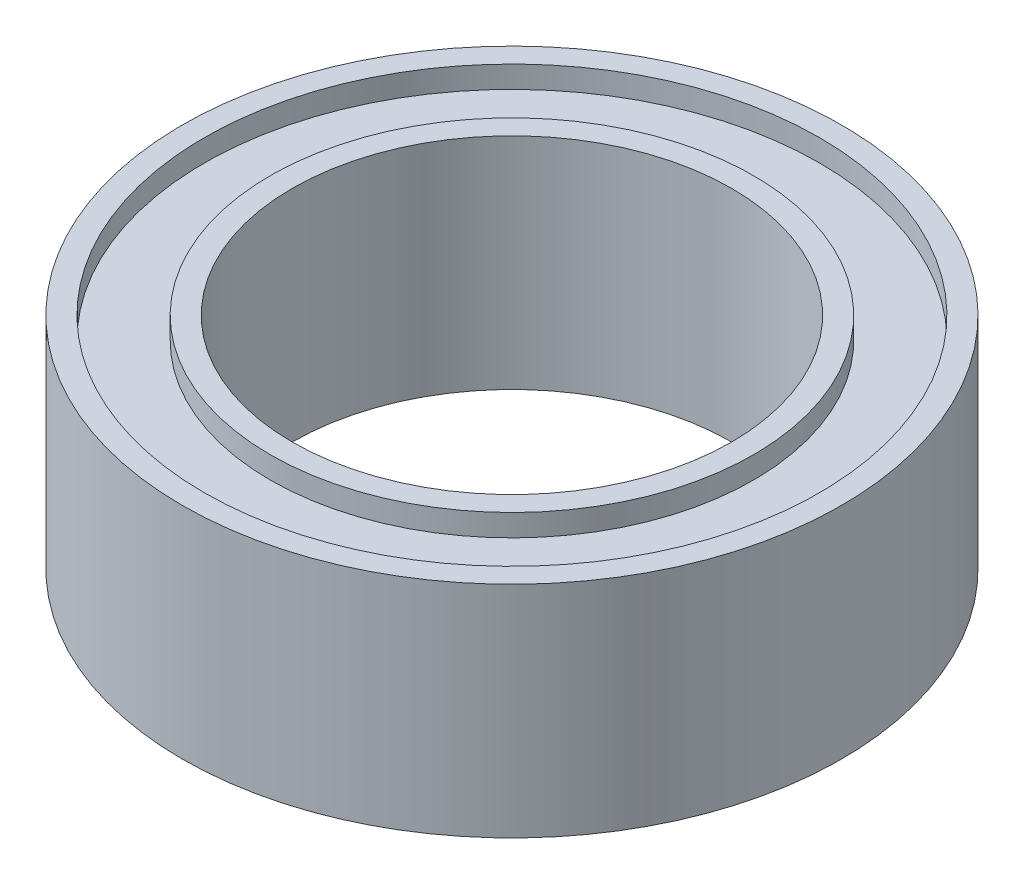
ISO-10303-21;
HEADER;
FILE_DESCRIPTION(('STEP AP214'),'2;1');
FILE_NAME('part.step','',(''),(''),'','','');
FILE_SCHEMA(('AUTOMOTIVE_DESIGN { 1 0 10303 214 1 1 1 1 }'));
ENDSEC;
DATA;
#1=APPLICATION_CONTEXT('core data for automotive mechanical design processes');
#2=APPLICATION_PROTOCOL_DEFINITION('international standard','automotive_design',2000,#1);
#3=PRODUCT_CONTEXT('',#1,'mechanical');
#4=PRODUCT('Part','Part','',(#3));
#5=PRODUCT_RELATED_PRODUCT_CATEGORY('part','',(#4));
#6=PRODUCT_DEFINITION_FORMATION('','',#4);
#7=PRODUCT_DEFINITION_CONTEXT('part definition',#1,'design');
#8=PRODUCT_DEFINITION('design','',#6,#7);
#9=PRODUCT_DEFINITION_SHAPE('','',#8);
#10=(LENGTH_UNIT() NAMED_UNIT(*) SI_UNIT(.MILLI.,.METRE.));
#11=(NAMED_UNIT(*) PLANE_ANGLE_UNIT() SI_UNIT($,.RADIAN.));
#12=(NAMED_UNIT(*) SI_UNIT($,.STERADIAN.) SOLID_ANGLE_UNIT());
#13=UNCERTAINTY_MEASURE_WITH_UNIT(LENGTH_MEASURE(1.E-05),#10,'distance_accuracy_value','');
#14=(GEOMETRIC_REPRESENTATION_CONTEXT(3) GLOBAL_UNCERTAINTY_ASSIGNED_CONTEXT((#13)) GLOBAL_UNIT_ASSIGNED_CONTEXT((#10,
#11,#12)) REPRESENTATION_CONTEXT('',''));
#15=CARTESIAN_POINT('',(0.,0.,0.));
#16=DIRECTION('',(0.,0.,1.));
#17=DIRECTION('',(1.,0.,0.));
#18=AXIS2_PLACEMENT_3D('',#15,#16,#17);
#19=CARTESIAN_POINT('',(0.,0.,0.));
#20=DIRECTION('',(0.,1.,0.));
#21=DIRECTION('',(0.,0.,1.));
#22=AXIS2_PLACEMENT_3D('',#19,#20,#21);
#23=PLANE('',#22);
#24=CARTESIAN_POINT('',(0.,0.,0.));
#25=DIRECTION('',(0.,1.,0.));
#26=DIRECTION('',(0.,0.,1.));
#27=AXIS2_PLACEMENT_3D('',#24,#25,#26);
#28=CIRCLE('',#27,5.);
#29=CARTESIAN_POINT('',(0.,0.,5.));
#30=VERTEX_POINT('',#29);
#31=EDGE_CURVE('E50',#30,#30,#28,.T.);
#32=ORIENTED_EDGE('',*,*,#31,.T.);
#33=EDGE_LOOP('',(#32));
#34=FACE_BOUND('',#33,.T.);
#35=CARTESIAN_POINT('',(0.,0.,0.));
#36=DIRECTION('',(0.,1.,0.));
#37=DIRECTION('',(0.,0.,1.));
#38=AXIS2_PLACEMENT_3D('',#35,#36,#37);
#39=CIRCLE('',#38,5.5);
#40=CARTESIAN_POINT('',(0.,0.,5.5));
#41=VERTEX_POINT('',#40);
#42=EDGE_CURVE('E74',#41,#41,#39,.T.);
#43=ORIENTED_EDGE('',*,*,#42,.F.);
#44=EDGE_LOOP('',(#43));
#45=FACE_BOUND('',#44,.T.);
#46=ADVANCED_FACE('F37',(#34,#45),#23,.F.);
#47=CARTESIAN_POINT('',(0.,5.,0.));
#48=DIRECTION('',(0.,1.,0.));
#49=DIRECTION('',(0.,0.,1.));
#50=AXIS2_PLACEMENT_3D('',#47,#48,#49);
#51=PLANE('',#50);
#52=CARTESIAN_POINT('',(0.,5.,0.));
#53=DIRECTION('',(0.,1.,0.));
#54=DIRECTION('',(0.,0.,1.));
#55=AXIS2_PLACEMENT_3D('',#52,#53,#54);
#56=CIRCLE('',#55,5.);
#57=CARTESIAN_POINT('',(0.,5.,5.));
#58=VERTEX_POINT('',#57);
#59=EDGE_CURVE('E48',#58,#58,#56,.T.);
#60=ORIENTED_EDGE('',*,*,#59,.F.);
#61=EDGE_LOOP('',(#60));
#62=FACE_BOUND('',#61,.T.);
#63=CARTESIAN_POINT('',(0.,5.,0.));
#64=DIRECTION('',(0.,1.,0.));
#65=DIRECTION('',(0.,0.,1.));
#66=AXIS2_PLACEMENT_3D('',#63,#64,#65);
#67=CIRCLE('',#66,5.5);
#68=CARTESIAN_POINT('',(0.,5.,5.5));
#69=VERTEX_POINT('',#68);
#70=EDGE_CURVE('E62',#69,#69,#67,.T.);
#71=ORIENTED_EDGE('',*,*,#70,.T.);
#72=EDGE_LOOP('',(#71));
#73=FACE_BOUND('',#72,.T.);
#74=ADVANCED_FACE('F90',(#62,#73),#51,.T.);
#75=CARTESIAN_POINT('',(0.,5.,0.));
#76=DIRECTION('',(0.,1.,0.));
#77=DIRECTION('',(0.,0.,1.));
#78=AXIS2_PLACEMENT_3D('',#75,#76,#77);
#79=CIRCLE('',#78,7.);
#80=CARTESIAN_POINT('',(0.,5.,7.));
#81=VERTEX_POINT('',#80);
#82=EDGE_CURVE('E56',#81,#81,#79,.T.);
#83=ORIENTED_EDGE('',*,*,#82,.F.);
#84=EDGE_LOOP('',(#83));
#85=FACE_BOUND('',#84,.T.);
#86=CARTESIAN_POINT('',(0.,5.,0.));
#87=DIRECTION('',(0.,1.,0.));
#88=DIRECTION('',(0.,0.,1.));
#89=AXIS2_PLACEMENT_3D('',#86,#87,#88);
#90=CIRCLE('',#89,7.5);
#91=CARTESIAN_POINT('',(0.,5.,7.5));
#92=VERTEX_POINT('',#91);
#93=EDGE_CURVE('E10',#92,#92,#90,.T.);
#94=ORIENTED_EDGE('',*,*,#93,.T.);
#95=EDGE_LOOP('',(#94));
#96=FACE_BOUND('',#95,.T.);
#97=ADVANCED_FACE('F96',(#85,#96),#51,.T.);
#98=CARTESIAN_POINT('',(0.,0.,0.));
#99=DIRECTION('',(0.,1.,0.));
#100=DIRECTION('',(0.,0.,1.));
#101=AXIS2_PLACEMENT_3D('',#98,#99,#100);
#102=CIRCLE('',#101,7.);
#103=CARTESIAN_POINT('',(0.,0.,7.));
#104=VERTEX_POINT('',#103);
#105=EDGE_CURVE('E68',#104,#104,#102,.T.);
#106=ORIENTED_EDGE('',*,*,#105,.T.);
#107=EDGE_LOOP('',(#106));
#108=FACE_BOUND('',#107,.T.);
#109=CARTESIAN_POINT('',(0.,0.,0.));
#110=DIRECTION('',(0.,1.,0.));
#111=DIRECTION('',(0.,0.,1.));
#112=AXIS2_PLACEMENT_3D('',#109,#110,#111);
#113=CIRCLE('',#112,7.5);
#114=CARTESIAN_POINT('',(0.,0.,7.5));
#115=VERTEX_POINT('',#114);
#116=EDGE_CURVE('E41',#115,#115,#113,.T.);
#117=ORIENTED_EDGE('',*,*,#116,.F.);
#118=EDGE_LOOP('',(#117));
#119=FACE_BOUND('',#118,.T.);
#120=ADVANCED_FACE('F92',(#108,#119),#23,.F.);
#121=CARTESIAN_POINT('',(0.,5.,0.));
#122=DIRECTION('',(0.,-1.,0.));
#123=DIRECTION('',(0.,0.,-1.));
#124=AXIS2_PLACEMENT_3D('',#121,#122,#123);
#125=CYLINDRICAL_SURFACE('',#124,7.5);
#126=ORIENTED_EDGE('',*,*,#93,.F.);
#127=EDGE_LOOP('',(#126));
#128=FACE_BOUND('',#127,.T.);
#129=ORIENTED_EDGE('',*,*,#116,.T.);
#130=EDGE_LOOP('',(#129));
#131=FACE_BOUND('',#130,.T.);
#132=ADVANCED_FACE('F39',(#128,#131),#125,.T.);
#133=CARTESIAN_POINT('',(0.,5.,0.));
#134=DIRECTION('',(0.,-1.,0.));
#135=DIRECTION('',(0.,0.,-1.));
#136=AXIS2_PLACEMENT_3D('',#133,#134,#135);
#137=CYLINDRICAL_SURFACE('',#136,5.);
#138=ORIENTED_EDGE('',*,*,#59,.T.);
#139=EDGE_LOOP('',(#138));
#140=FACE_BOUND('',#139,.T.);
#141=ORIENTED_EDGE('',*,*,#31,.F.);
#142=EDGE_LOOP('',(#141));
#143=FACE_BOUND('',#142,.T.);
#144=ADVANCED_FACE('F105',(#140,#143),#137,.F.);
#145=CARTESIAN_POINT('',(0.,4.5,0.));
#146=DIRECTION('',(0.,1.,0.));
#147=DIRECTION('',(0.,0.,1.));
#148=AXIS2_PLACEMENT_3D('',#145,#146,#147);
#149=CYLINDRICAL_SURFACE('',#148,7.);
#150=CARTESIAN_POINT('',(0.,4.5,0.));
#151=DIRECTION('',(0.,1.,0.));
#152=DIRECTION('',(0.,0.,1.));
#153=AXIS2_PLACEMENT_3D('',#150,#151,#152);
#154=CIRCLE('',#153,7.);
#155=CARTESIAN_POINT('',(0.,4.5,7.));
#156=VERTEX_POINT('',#155);
#157=EDGE_CURVE('E53',#156,#156,#154,.T.);
#158=ORIENTED_EDGE('',*,*,#157,.F.);
#159=EDGE_LOOP('',(#158));
#160=FACE_BOUND('',#159,.T.);
#161=ORIENTED_EDGE('',*,*,#82,.T.);
#162=EDGE_LOOP('',(#161));
#163=FACE_BOUND('',#162,.T.);
#164=ADVANCED_FACE('F129',(#160,#163),#149,.F.);
#165=CARTESIAN_POINT('',(0.,4.5,0.));
#166=DIRECTION('',(0.,1.,0.));
#167=DIRECTION('',(0.,0.,1.));
#168=AXIS2_PLACEMENT_3D('',#165,#166,#167);
#169=PLANE('',#168);
#170=CARTESIAN_POINT('',(0.,4.5,0.));
#171=DIRECTION('',(0.,1.,0.));
#172=DIRECTION('',(0.,0.,1.));
#173=AXIS2_PLACEMENT_3D('',#170,#171,#172);
#174=CIRCLE('',#173,5.5);
#175=CARTESIAN_POINT('',(0.,4.5,5.5));
#176=VERTEX_POINT('',#175);
#177=EDGE_CURVE('E59',#176,#176,#174,.T.);
#178=ORIENTED_EDGE('',*,*,#177,.F.);
#179=EDGE_LOOP('',(#178));
#180=FACE_BOUND('',#179,.T.);
#181=ORIENTED_EDGE('',*,*,#157,.T.);
#182=EDGE_LOOP('',(#181));
#183=FACE_BOUND('',#182,.T.);
#184=ADVANCED_FACE('F125',(#180,#183),#169,.T.);
#185=CARTESIAN_POINT('',(0.,4.5,0.));
#186=DIRECTION('',(0.,1.,0.));
#187=DIRECTION('',(0.,0.,1.));
#188=AXIS2_PLACEMENT_3D('',#185,#186,#187);
#189=CYLINDRICAL_SURFACE('',#188,5.5);
#190=ORIENTED_EDGE('',*,*,#177,.T.);
#191=EDGE_LOOP('',(#190));
#192=FACE_BOUND('',#191,.T.);
#193=ORIENTED_EDGE('',*,*,#70,.F.);
#194=EDGE_LOOP('',(#193));
#195=FACE_BOUND('',#194,.T.);
#196=ADVANCED_FACE('F119',(#192,#195),#189,.T.);
#197=CARTESIAN_POINT('',(0.,0.5,0.));
#198=DIRECTION('',(0.,-1.,0.));
#199=DIRECTION('',(0.,0.,1.));
#200=AXIS2_PLACEMENT_3D('',#197,#198,#199);
#201=PLANE('',#200);
#202=CARTESIAN_POINT('',(0.,0.5,0.));
#203=DIRECTION('',(0.,1.,0.));
#204=DIRECTION('',(0.,0.,1.));
#205=AXIS2_PLACEMENT_3D('',#202,#203,#204);
#206=CIRCLE('',#205,7.);
#207=CARTESIAN_POINT('',(0.,0.5,7.));
#208=VERTEX_POINT('',#207);
#209=EDGE_CURVE('E65',#208,#208,#206,.T.);
#210=ORIENTED_EDGE('',*,*,#209,.F.);
#211=EDGE_LOOP('',(#210));
#212=FACE_BOUND('',#211,.T.);
#213=CARTESIAN_POINT('',(0.,0.5,0.));
#214=DIRECTION('',(0.,1.,0.));
#215=DIRECTION('',(0.,0.,1.));
#216=AXIS2_PLACEMENT_3D('',#213,#214,#215);
#217=CIRCLE('',#216,5.5);
#218=CARTESIAN_POINT('',(0.,0.5,5.5));
#219=VERTEX_POINT('',#218);
#220=EDGE_CURVE('E71',#219,#219,#217,.T.);
#221=ORIENTED_EDGE('',*,*,#220,.T.);
#222=EDGE_LOOP('',(#221));
#223=FACE_BOUND('',#222,.T.);
#224=ADVANCED_FACE('F80',(#212,#223),#201,.T.);
#225=CARTESIAN_POINT('',(0.,0.5,0.));
#226=DIRECTION('',(0.,-1.,0.));
#227=DIRECTION('',(0.,0.,-1.));
#228=AXIS2_PLACEMENT_3D('',#225,#226,#227);
#229=CYLINDRICAL_SURFACE('',#228,7.);
#230=ORIENTED_EDGE('',*,*,#209,.T.);
#231=EDGE_LOOP('',(#230));
#232=FACE_BOUND('',#231,.T.);
#233=ORIENTED_EDGE('',*,*,#105,.F.);
#234=EDGE_LOOP('',(#233));
#235=FACE_BOUND('',#234,.T.);
#236=ADVANCED_FACE('F85',(#232,#235),#229,.F.);
#237=CARTESIAN_POINT('',(0.,0.5,0.));
#238=DIRECTION('',(0.,-1.,0.));
#239=DIRECTION('',(0.,0.,-1.));
#240=AXIS2_PLACEMENT_3D('',#237,#238,#239);
#241=CYLINDRICAL_SURFACE('',#240,5.5);
#242=ORIENTED_EDGE('',*,*,#220,.F.);
#243=EDGE_LOOP('',(#242));
#244=FACE_BOUND('',#243,.T.);
#245=ORIENTED_EDGE('',*,*,#42,.T.);
#246=EDGE_LOOP('',(#245));
#247=FACE_BOUND('',#246,.T.);
#248=ADVANCED_FACE('F82',(#244,#247),#241,.T.);
#249=CLOSED_SHELL('',(#46,#74,#97,#120,#132,#144,#164,#184,#196,#224,#236,#248));
#250=MANIFOLD_SOLID_BREP('B2',#249);
#251=ADVANCED_BREP_SHAPE_REPRESENTATION('',(#18,#250),#14);
#252=SHAPE_DEFINITION_REPRESENTATION(#9,#251);
ENDSEC;
END-ISO-10303-21;
